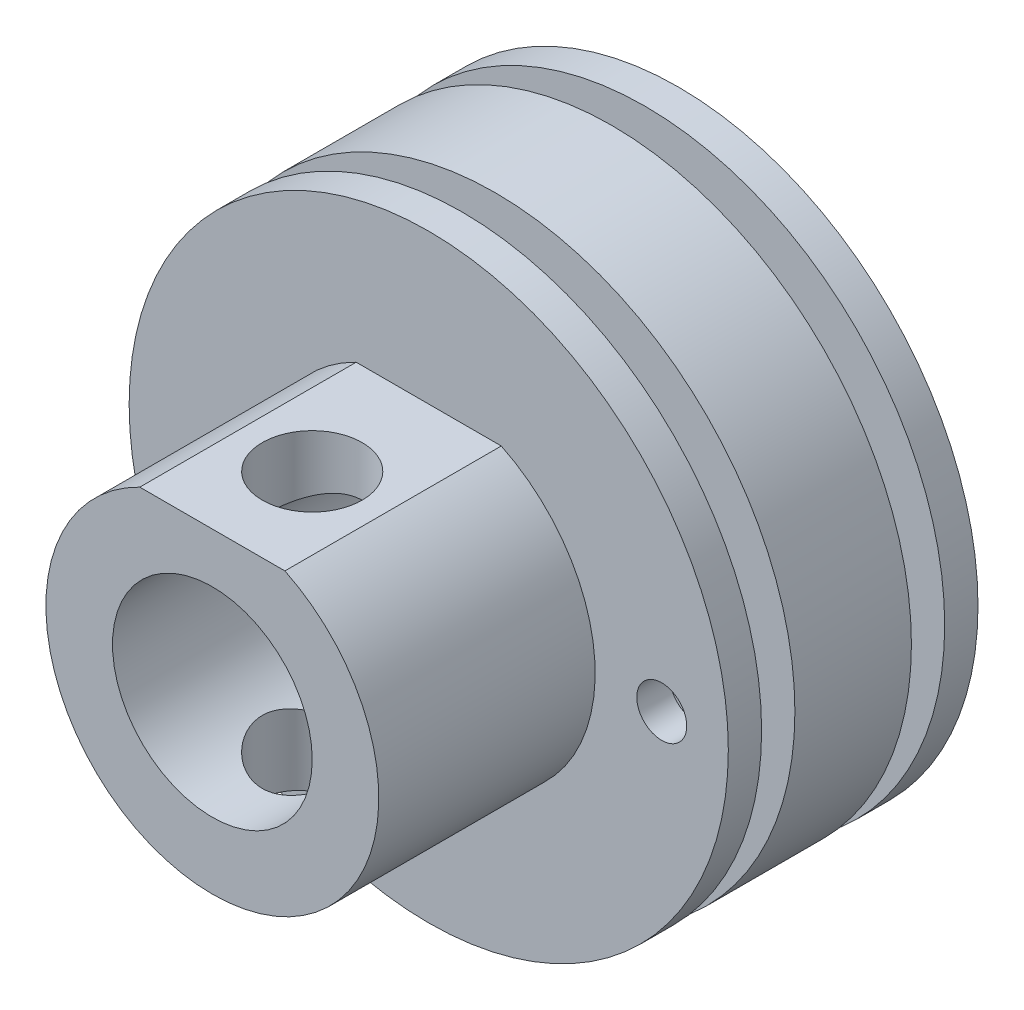
ISO-10303-21;
HEADER;
FILE_DESCRIPTION(('STEP AP214'),'2;1');
FILE_NAME('part.step','',(''),(''),'','','');
FILE_SCHEMA(('AUTOMOTIVE_DESIGN { 1 0 10303 214 1 1 1 1 }'));
ENDSEC;
DATA;
#1=APPLICATION_CONTEXT('core data for automotive mechanical design processes');
#2=APPLICATION_PROTOCOL_DEFINITION('international standard','automotive_design',2000,#1);
#3=PRODUCT_CONTEXT('',#1,'mechanical');
#4=PRODUCT('Part','Part','',(#3));
#5=PRODUCT_RELATED_PRODUCT_CATEGORY('part','',(#4));
#6=PRODUCT_DEFINITION_FORMATION('','',#4);
#7=PRODUCT_DEFINITION_CONTEXT('part definition',#1,'design');
#8=PRODUCT_DEFINITION('design','',#6,#7);
#9=PRODUCT_DEFINITION_SHAPE('','',#8);
#10=(LENGTH_UNIT() NAMED_UNIT(*) SI_UNIT(.MILLI.,.METRE.));
#11=(NAMED_UNIT(*) PLANE_ANGLE_UNIT() SI_UNIT($,.RADIAN.));
#12=(NAMED_UNIT(*) SI_UNIT($,.STERADIAN.) SOLID_ANGLE_UNIT());
#13=UNCERTAINTY_MEASURE_WITH_UNIT(LENGTH_MEASURE(1.E-05),#10,'distance_accuracy_value','');
#14=(GEOMETRIC_REPRESENTATION_CONTEXT(3) GLOBAL_UNCERTAINTY_ASSIGNED_CONTEXT((#13)) GLOBAL_UNIT_ASSIGNED_CONTEXT((#10,
#11,#12)) REPRESENTATION_CONTEXT('',''));
#15=CARTESIAN_POINT('',(0.,0.,0.));
#16=DIRECTION('',(0.,0.,1.));
#17=DIRECTION('',(1.,0.,0.));
#18=AXIS2_PLACEMENT_3D('',#15,#16,#17);
#19=CARTESIAN_POINT('',(0.,0.,14.));
#20=DIRECTION('',(0.,0.,-1.));
#21=DIRECTION('',(-1.,0.,0.));
#22=AXIS2_PLACEMENT_3D('',#19,#20,#21);
#23=CYLINDRICAL_SURFACE('',#22,5.);
#24=CARTESIAN_POINT('',(0.,-5.,12.5));
#25=CARTESIAN_POINT('',(0.0822886127532999,-4.9999992925055,12.4999990025151));
#26=CARTESIAN_POINT('',(0.164587318351529,-4.99794915693954,12.493206136376));
#27=CARTESIAN_POINT('',(0.326788125304881,-4.98997105593691,12.4662786457779));
#28=CARTESIAN_POINT('',(0.40668950441142,-4.98404193389692,12.4461400419767));
#29=CARTESIAN_POINT('',(0.561732707754526,-4.96895552501836,12.3932539830897));
#30=CARTESIAN_POINT('',(0.636881364395372,-4.95980300250425,12.3605251303811));
#31=CARTESIAN_POINT('',(0.780624181053131,-4.93922109237645,12.2834639069442));
#32=CARTESIAN_POINT('',(0.849217467469669,-4.92779140192067,12.2391299926046));
#33=CARTESIAN_POINT('',(0.979871797183745,-4.90350737192774,12.1387759925273));
#34=CARTESIAN_POINT('',(1.04171807124434,-4.89062383657036,12.0824833741141));
#35=CARTESIAN_POINT('',(1.15524920923324,-4.86505834210442,11.9603907700898));
#36=CARTESIAN_POINT('',(1.20693236327441,-4.85237641724501,11.894589187875));
#37=CARTESIAN_POINT('',(1.29980037723708,-4.82834113993772,11.7535292469624));
#38=CARTESIAN_POINT('',(1.34072309022213,-4.81702406663875,11.6780915390093));
#39=CARTESIAN_POINT('',(1.4092139477476,-4.79743620394031,11.5210107457697));
#40=CARTESIAN_POINT('',(1.43678529919973,-4.78916468313311,11.439369156072));
#41=CARTESIAN_POINT('',(1.47701633682652,-4.77690870838434,11.2746097338695));
#42=CARTESIAN_POINT('',(1.49007196234677,-4.77281069324533,11.1915972561361));
#43=CARTESIAN_POINT('',(1.50213730614672,-4.76902789749767,11.0244668437832));
#44=CARTESIAN_POINT('',(1.50115042761078,-4.76934204760571,10.9403491819409));
#45=CARTESIAN_POINT('',(1.48546977199812,-4.77424744067778,10.7766160913915));
#46=CARTESIAN_POINT('',(1.47127205262685,-4.7786838859914,10.6969477496378));
#47=CARTESIAN_POINT('',(1.43037420427056,-4.79108356228624,10.5411802137265));
#48=CARTESIAN_POINT('',(1.40367284141641,-4.79904714132351,10.4650813726257));
#49=CARTESIAN_POINT('',(1.33816026653682,-4.81772733074973,10.3173996503393));
#50=CARTESIAN_POINT('',(1.29918816934643,-4.82848016115952,10.2458929160447));
#51=CARTESIAN_POINT('',(1.21035222588683,-4.85150987000065,10.1102679779898));
#52=CARTESIAN_POINT('',(1.16048574002588,-4.86378711746991,10.0461515705862));
#53=CARTESIAN_POINT('',(1.04881290765546,-4.88911011297937,9.92431380923798));
#54=CARTESIAN_POINT('',(0.986594907466972,-4.90216654310498,9.86697133597033));
#55=CARTESIAN_POINT('',(0.853263259313967,-4.92712244063259,9.76344601593575));
#56=CARTESIAN_POINT('',(0.782149051860888,-4.9390218351841,9.71726387158557));
#57=CARTESIAN_POINT('',(0.632355038342803,-4.9604316006947,9.63714007753527));
#58=CARTESIAN_POINT('',(0.55362774974795,-4.96992543668314,9.60328248375014));
#59=CARTESIAN_POINT('',(0.39124541560352,-4.98533521832222,9.54940040990037));
#60=CARTESIAN_POINT('',(0.307591751589582,-4.99125216186999,9.52937207146751));
#61=CARTESIAN_POINT('',(0.140952242668333,-4.99868364643538,9.5043478221006));
#62=CARTESIAN_POINT('',(0.0580500976011877,-5.0003485041779,9.49883841419839));
#63=CARTESIAN_POINT('',(-0.107499605823383,-4.9995292324176,9.50156915571208));
#64=CARTESIAN_POINT('',(-0.19014719669078,-4.99704565677756,9.50980746965144));
#65=CARTESIAN_POINT('',(-0.350903605309696,-4.98830696987163,9.5393846111115));
#66=CARTESIAN_POINT('',(-0.429072772614169,-4.98213829799417,9.56042338758087));
#67=CARTESIAN_POINT('',(-0.580754638954521,-4.96674347841533,9.6146432327782));
#68=CARTESIAN_POINT('',(-0.654266777025583,-4.95751696321085,9.64782576103786));
#69=CARTESIAN_POINT('',(-0.796437189461052,-4.93669654351325,9.72625316548113));
#70=CARTESIAN_POINT('',(-0.864943826199669,-4.92505280829675,9.77175934094797));
#71=CARTESIAN_POINT('',(-0.993523307980146,-4.90073468764318,9.87322475405281));
#72=CARTESIAN_POINT('',(-1.05359403235593,-4.8880600443108,9.92918661188767));
#73=CARTESIAN_POINT('',(-1.16585744551027,-4.86253171869138,10.0523873083693));
#74=CARTESIAN_POINT('',(-1.21768481231503,-4.84968825033268,10.1199618757717));
#75=CARTESIAN_POINT('',(-1.30928995072154,-4.82576515238463,10.2631279390135));
#76=CARTESIAN_POINT('',(-1.34906803829472,-4.81468547654651,10.3387192245582));
#77=CARTESIAN_POINT('',(-1.41517347127168,-4.79567189615055,10.4955324912547));
#78=CARTESIAN_POINT('',(-1.4415634693705,-4.78772337843827,10.5767261865366));
#79=CARTESIAN_POINT('',(-1.48021730815114,-4.77591594362794,10.7426879689315));
#80=CARTESIAN_POINT('',(-1.49248598978779,-4.772055625083,10.8274548207877));
#81=CARTESIAN_POINT('',(-1.50221984485059,-4.76899972496087,10.9943615183762));
#82=CARTESIAN_POINT('',(-1.5002805530849,-4.76961647442755,11.0764636510176));
#83=CARTESIAN_POINT('',(-1.48307505444813,-4.77499401288294,11.2391141033728));
#84=CARTESIAN_POINT('',(-1.46780938124716,-4.77975463592551,11.3196624851764));
#85=CARTESIAN_POINT('',(-1.42476888804136,-4.79275763670385,11.4759453991428));
#86=CARTESIAN_POINT('',(-1.39715175507068,-4.80095604545965,11.5517272873617));
#87=CARTESIAN_POINT('',(-1.33031507121129,-4.81990278909136,11.6976424388177));
#88=CARTESIAN_POINT('',(-1.29109329962876,-4.83065161194312,11.7677746176408));
#89=CARTESIAN_POINT('',(-1.20048763805072,-4.85397676425833,11.9031631165271));
#90=CARTESIAN_POINT('',(-1.14871276092994,-4.86660540163798,11.9681487612604));
#91=CARTESIAN_POINT('',(-1.03517434629782,-4.89201320450026,12.0887024983079));
#92=CARTESIAN_POINT('',(-0.973408217134501,-4.90479240823905,12.1442681394678));
#93=CARTESIAN_POINT('',(-0.839465762183249,-4.92950936570649,12.246023412295));
#94=CARTESIAN_POINT('',(-0.767037885790609,-4.94141159765674,12.2918914468555));
#95=CARTESIAN_POINT('',(-0.615141373983531,-4.96260680455813,12.370735169904));
#96=CARTESIAN_POINT('',(-0.535676052998956,-4.97190099931067,12.4037168882745));
#97=CARTESIAN_POINT('',(-0.380757712655282,-4.98602174969301,12.4528952756527));
#98=CARTESIAN_POINT('',(-0.305786961954235,-4.99122027381068,12.4705116728832));
#99=CARTESIAN_POINT('',(-0.153880195230779,-4.99820944494492,12.4940635252416));
#100=CARTESIAN_POINT('',(-0.0769445098581395,-5.0000006615474,12.5000009327048));
#101=CARTESIAN_POINT('',(0.,-5.,12.5));
#102=B_SPLINE_CURVE_WITH_KNOTS('',3,(#24,#25,#26,#27,#28,#29,#30,#31,#32,#33,#34,#35,#36,#37,
#38,#39,#40,#41,#42,#43,#44,#45,#46,#47,#48,#49,#50,#51,#52,#53,#54,#55,#56,#57,#58,#59,#60,#61,
#62,#63,#64,#65,#66,#67,#68,#69,#70,#71,#72,#73,#74,#75,#76,#77,#78,#79,#80,#81,#82,#83,#84,#85,
#86,#87,#88,#89,#90,#91,#92,#93,#94,#95,#96,#97,#98,#99,#100,#101),.UNSPECIFIED.,.T.,.F.,(4,2,2,
2,2,2,2,2,2,2,2,2,2,2,2,2,2,2,2,2,2,2,2,2,2,2,2,2,2,2,2,2,2,2,2,2,2,2,4),(0.,0.246583203612611,
0.493239964845999,0.739533676300874,0.985860164412702,1.23855602948191,1.49129437288633,
1.74971481004109,2.00807314543223,2.25919689356599,2.51025978319089,2.75226016697676,
2.99428443658001,3.23962426447119,3.48502360158555,3.74067104048167,3.99633456531071,
4.25371046881689,4.51101453528808,4.75908809438545,5.00712853550327,5.24956746682327,
5.49203554593728,5.74011305702908,5.98825282000191,6.24540400322818,6.5025484425268,
6.75847814951251,7.01432009460283,7.25950155466943,7.504673196616,7.74680040402721,
7.98897397553107,8.2399692567993,8.49102974897502,8.7494299615667,9.00770911595235,
9.23831691930459,9.46888616948874),.UNSPECIFIED.);
#103=CARTESIAN_POINT('',(0.,-5.,12.5));
#104=VERTEX_POINT('',#103);
#105=EDGE_CURVE('E128',#104,#104,#102,.T.);
#106=ORIENTED_EDGE('',*,*,#105,.T.);
#107=EDGE_LOOP('',(#106));
#108=FACE_BOUND('',#107,.T.);
#109=DIRECTION('',(0.,0.,-1.));
#110=VECTOR('',#109,1.);
#111=CARTESIAN_POINT('',(2.17944947177034,4.5,14.));
#112=LINE('',#111,#110);
#113=CARTESIAN_POINT('',(2.17944947177034,4.5,14.));
#114=VERTEX_POINT('',#113);
#115=CARTESIAN_POINT('',(2.17944947177034,4.5,7.5));
#116=VERTEX_POINT('',#115);
#117=EDGE_CURVE('E81',#114,#116,#112,.T.);
#118=ORIENTED_EDGE('',*,*,#117,.F.);
#119=CARTESIAN_POINT('',(0.,0.,14.));
#120=DIRECTION('',(0.,0.,1.));
#121=DIRECTION('',(1.,0.,0.));
#122=AXIS2_PLACEMENT_3D('',#119,#120,#121);
#123=CIRCLE('',#122,5.);
#124=CARTESIAN_POINT('',(-2.17944947177034,4.5,14.));
#125=VERTEX_POINT('',#124);
#126=EDGE_CURVE('E88',#125,#114,#123,.T.);
#127=ORIENTED_EDGE('',*,*,#126,.F.);
#128=DIRECTION('',(0.,0.,-1.));
#129=VECTOR('',#128,1.);
#130=CARTESIAN_POINT('',(-2.17944947177034,4.5,14.));
#131=LINE('',#130,#129);
#132=CARTESIAN_POINT('',(-2.17944947177034,4.5,7.5));
#133=VERTEX_POINT('',#132);
#134=EDGE_CURVE('E69',#133,#125,#131,.F.);
#135=ORIENTED_EDGE('',*,*,#134,.F.);
#136=CARTESIAN_POINT('',(0.,0.,7.5));
#137=DIRECTION('',(0.,0.,1.));
#138=DIRECTION('',(1.,0.,0.));
#139=AXIS2_PLACEMENT_3D('',#136,#137,#138);
#140=CIRCLE('',#139,5.);
#141=EDGE_CURVE('E90',#133,#116,#140,.T.);
#142=ORIENTED_EDGE('',*,*,#141,.T.);
#143=EDGE_LOOP('',(#118,#127,#135,#142));
#144=FACE_BOUND('',#143,.T.);
#145=ADVANCED_FACE('F52',(#108,#144),#23,.T.);
#146=CARTESIAN_POINT('',(0.,0.,14.));
#147=DIRECTION('',(0.,0.,1.));
#148=DIRECTION('',(1.,0.,0.));
#149=AXIS2_PLACEMENT_3D('',#146,#147,#148);
#150=PLANE('',#149);
#151=CARTESIAN_POINT('',(0.,0.,14.));
#152=DIRECTION('',(0.,0.,1.));
#153=DIRECTION('',(1.,0.,0.));
#154=AXIS2_PLACEMENT_3D('',#151,#152,#153);
#155=CIRCLE('',#154,3.);
#156=CARTESIAN_POINT('',(3.,0.,14.));
#157=VERTEX_POINT('',#156);
#158=EDGE_CURVE('E100',#157,#157,#155,.T.);
#159=ORIENTED_EDGE('',*,*,#158,.F.);
#160=EDGE_LOOP('',(#159));
#161=FACE_BOUND('',#160,.T.);
#162=ORIENTED_EDGE('',*,*,#126,.T.);
#163=DIRECTION('',(-1.,0.,0.));
#164=VECTOR('',#163,1.);
#165=CARTESIAN_POINT('',(9.,4.5,14.));
#166=LINE('',#165,#164);
#167=EDGE_CURVE('E78',#114,#125,#166,.T.);
#168=ORIENTED_EDGE('',*,*,#167,.T.);
#169=EDGE_LOOP('',(#162,#168));
#170=FACE_BOUND('',#169,.T.);
#171=ADVANCED_FACE('F93',(#161,#170),#150,.T.);
#172=CARTESIAN_POINT('',(0.,-9.,11.));
#173=DIRECTION('',(0.,1.,0.));
#174=DIRECTION('',(0.,0.,1.));
#175=AXIS2_PLACEMENT_3D('',#172,#173,#174);
#176=CYLINDRICAL_SURFACE('',#175,1.5);
#177=CARTESIAN_POINT('',(0.,3.,12.5));
#178=CARTESIAN_POINT('',(0.0788579444268502,2.99999570107562,12.4999950465242));
#179=CARTESIAN_POINT('',(0.157809899546344,2.99685736529635,12.4937448903184));
#180=CARTESIAN_POINT('',(0.313380352903344,2.98461234055735,12.4690206794877));
#181=CARTESIAN_POINT('',(0.389994130070444,2.97549431743379,12.4505234105033));
#182=CARTESIAN_POINT('',(0.538400317320673,2.95224419105063,12.4022092870751));
#183=CARTESIAN_POINT('',(0.61021020440872,2.93813158766306,12.372436423628));
#184=CARTESIAN_POINT('',(0.747708925209898,2.90618664773642,12.3026440679525));
#185=CARTESIAN_POINT('',(0.813398240985089,2.88835460450288,12.2626253836267));
#186=CARTESIAN_POINT('',(0.941261726642864,2.84934387387093,12.1707241257721));
#187=CARTESIAN_POINT('',(1.00298281668316,2.82802798691306,12.1182702811405));
#188=CARTESIAN_POINT('',(1.11716916730047,2.78489955370115,12.0042177811294));
#189=CARTESIAN_POINT('',(1.16962737466015,2.76308664313552,11.9426122223413));
#190=CARTESIAN_POINT('',(1.26787800067542,2.71948426796021,11.8062749757149));
#191=CARTESIAN_POINT('',(1.31283800332746,2.69782780455198,11.7308958524811));
#192=CARTESIAN_POINT('',(1.38925234033604,2.65928968158481,11.5724489960207));
#193=CARTESIAN_POINT('',(1.4207163224495,2.64240461410484,11.4893868069159));
#194=CARTESIAN_POINT('',(1.46719866328288,2.61686800556713,11.3230023418671));
#195=CARTESIAN_POINT('',(1.48308878562066,2.6077840737557,11.2399933218989));
#196=CARTESIAN_POINT('',(1.50064048996327,2.59772834922792,11.0720317433308));
#197=CARTESIAN_POINT('',(1.50231613255961,2.59674854014932,10.9870811886933));
#198=CARTESIAN_POINT('',(1.49203093075844,2.60266395385873,10.8285709635269));
#199=CARTESIAN_POINT('',(1.48167683930523,2.6086314549302,10.7548639531654));
#200=CARTESIAN_POINT('',(1.4504097735854,2.62614343100775,10.6104171359404));
#201=CARTESIAN_POINT('',(1.42949343584648,2.63768968247664,10.539678282042));
#202=CARTESIAN_POINT('',(1.37731467057901,2.66531214619112,10.4011563011515));
#203=CARTESIAN_POINT('',(1.34582260067399,2.68148760995998,10.3334804018213));
#204=CARTESIAN_POINT('',(1.273562531502,2.71655106422106,10.204048561115));
#205=CARTESIAN_POINT('',(1.2327903657187,2.73544027170286,10.1422952965999));
#206=CARTESIAN_POINT('',(1.13709908236918,2.77669736854929,10.0182181208852));
#207=CARTESIAN_POINT('',(1.08104168755392,2.79920265355119,9.95681468963576));
#208=CARTESIAN_POINT('',(0.959333368112061,2.84321434950611,9.84389687211365));
#209=CARTESIAN_POINT('',(0.893677884861429,2.86472027938201,9.79238721194917));
#210=CARTESIAN_POINT('',(0.750774758747774,2.90552980924446,9.69847150845541));
#211=CARTESIAN_POINT('',(0.673130387399115,2.92468476243011,9.65659929133139));
#212=CARTESIAN_POINT('',(0.510699323233197,2.95736821681863,9.58685445643549));
#213=CARTESIAN_POINT('',(0.425918364397915,2.9709011841533,9.55897072247725));
#214=CARTESIAN_POINT('',(0.259149737491054,2.98986500612153,9.52028689442498));
#215=CARTESIAN_POINT('',(0.17751229582249,2.99587407451965,9.50826314637983));
#216=CARTESIAN_POINT('',(0.0131693999240284,3.00109520188655,9.49780290329827));
#217=CARTESIAN_POINT('',(-0.0695355298048623,3.00031048081978,9.4993599715408));
#218=CARTESIAN_POINT('',(-0.226849457978979,2.99236788380152,9.51531003262811));
#219=CARTESIAN_POINT('',(-0.301589112074894,2.98570868532253,9.52869879909499));
#220=CARTESIAN_POINT('',(-0.447610338452911,2.9673325697226,9.56635710784268));
#221=CARTESIAN_POINT('',(-0.51889152853663,2.95561509501618,9.59062784968024));
#222=CARTESIAN_POINT('',(-0.658332912674358,2.92776377120382,9.64999769964955));
#223=CARTESIAN_POINT('',(-0.726345595508704,2.91151322654446,9.68538657517443));
#224=CARTESIAN_POINT('',(-0.855692042548907,2.87615961476126,9.76566130346985));
#225=CARTESIAN_POINT('',(-0.917022944664886,2.85705533350407,9.81055120189309));
#226=CARTESIAN_POINT('',(-1.03765153393382,2.81562332004297,9.91364063799607));
#227=CARTESIAN_POINT('',(-1.09615811672854,2.79316327265249,9.97271430266772));
#228=CARTESIAN_POINT('',(-1.20278448167828,2.7489358741323,10.0998877269166));
#229=CARTESIAN_POINT('',(-1.25089707856781,2.72716901100071,10.1679936782719));
#230=CARTESIAN_POINT('',(-1.33756187171853,2.68576788309734,10.3154654812595));
#231=CARTESIAN_POINT('',(-1.37553824370037,2.66628794383591,10.3952168991417));
#232=CARTESIAN_POINT('',(-1.43712423890206,2.63361108441202,10.5612651013624));
#233=CARTESIAN_POINT('',(-1.46075237380052,2.62040607332625,10.6475532897003));
#234=CARTESIAN_POINT('',(-1.49079253120031,2.60342251538703,10.8153653343271));
#235=CARTESIAN_POINT('',(-1.49863949460818,2.59886075197597,10.8965513801529));
#236=CARTESIAN_POINT('',(-1.5010337315643,2.59748031962405,11.0591706007468));
#237=CARTESIAN_POINT('',(-1.49558676993486,2.60065829439585,11.1406036531068));
#238=CARTESIAN_POINT('',(-1.47288918838996,2.61356793076615,11.2932252523002));
#239=CARTESIAN_POINT('',(-1.45681247151455,2.62264641723988,11.3646507052171));
#240=CARTESIAN_POINT('',(-1.41476303733662,2.64556524281479,11.5037121791365));
#241=CARTESIAN_POINT('',(-1.38878713673988,2.65940711354503,11.571346973138));
#242=CARTESIAN_POINT('',(-1.32572361795085,2.69142795546803,11.7059372764798));
#243=CARTESIAN_POINT('',(-1.28800670672355,2.70983583593881,11.7725418527435));
#244=CARTESIAN_POINT('',(-1.20322645745609,2.74852997452291,11.8989118042719));
#245=CARTESIAN_POINT('',(-1.15615825686234,2.76881720693416,11.9586735957817));
#246=CARTESIAN_POINT('',(-1.04730498999206,2.81193484737138,12.077212973532));
#247=CARTESIAN_POINT('',(-0.984426634495894,2.83477474959942,12.1349886535254));
#248=CARTESIAN_POINT('',(-0.849232209349798,2.87816628389896,12.2393944751529));
#249=CARTESIAN_POINT('',(-0.776911084957797,2.89871667939293,12.2860186092049));
#250=CARTESIAN_POINT('',(-0.623897395174419,2.93547014349806,12.3668545440681));
#251=CARTESIAN_POINT('',(-0.543149255665096,2.95164144740899,12.4009762538547));
#252=CARTESIAN_POINT('',(-0.37611315170713,2.9775201194848,12.4547122516361));
#253=CARTESIAN_POINT('',(-0.28984169938365,2.98724585044602,12.4743677702086));
#254=CARTESIAN_POINT('',(-0.168902919736343,2.99543192870217,12.4908461166286));
#255=CARTESIAN_POINT('',(-0.135242819162348,2.99714048010376,12.4942739612995));
#256=CARTESIAN_POINT('',(-0.0677275977076381,2.99942545465223,12.4988519982711));
#257=CARTESIAN_POINT('',(-0.0338724714699431,3.00000184655072,12.5000021277053));
#258=CARTESIAN_POINT('',(0.,3.,12.5));
#259=B_SPLINE_CURVE_WITH_KNOTS('',3,(#177,#178,#179,#180,#181,#182,#183,#184,#185,#186,#187,
#188,#189,#190,#191,#192,#193,#194,#195,#196,#197,#198,#199,#200,#201,#202,#203,#204,#205,#206,
#207,#208,#209,#210,#211,#212,#213,#214,#215,#216,#217,#218,#219,#220,#221,#222,#223,#224,#225,
#226,#227,#228,#229,#230,#231,#232,#233,#234,#235,#236,#237,#238,#239,#240,#241,#242,#243,#244,
#245,#246,#247,#248,#249,#250,#251,#252,#253,#254,#255,#256,#257,#258),.UNSPECIFIED.,.T.,.F.,(4,
2,2,2,2,2,2,2,2,2,2,2,2,2,2,2,2,2,2,2,2,2,2,2,2,2,2,2,2,2,2,2,2,2,2,2,2,2,2,2,4),(0.,
0.236436386130439,0.473322224563796,0.709293233238448,0.945245640872352,1.19547263807713,
1.44588935648105,1.71572589646129,1.98536921847421,2.23887018210344,2.4921203599353,
2.7150856861398,2.93812205888517,3.16635360252731,3.39468781890332,3.65197412000818,
3.90938301898029,4.17874533321661,4.44789325368419,4.69474935707018,4.94148846767214,
5.16910359759183,5.39674382446397,5.63089284041848,5.86514176122509,6.12239415966628,
6.37982382923147,6.64972023242589,6.91926767918176,7.1629396125457,7.40650589797017,
7.62686895373283,7.84730293182526,8.0825468517043,8.31791341715446,8.58187864135757,
8.84598575071869,9.1119602049529,9.37717362931724,9.47872920200875,9.58028757766599),.UNSPECIFIED.);
#260=CARTESIAN_POINT('',(0.,3.,12.5));
#261=VERTEX_POINT('',#260);
#262=EDGE_CURVE('E103',#261,#261,#259,.T.);
#263=ORIENTED_EDGE('',*,*,#262,.F.);
#264=EDGE_LOOP('',(#263));
#265=FACE_BOUND('',#264,.T.);
#266=CARTESIAN_POINT('',(0.,4.5,11.));
#267=DIRECTION('',(0.,1.,0.));
#268=DIRECTION('',(0.,0.,1.));
#269=AXIS2_PLACEMENT_3D('',#266,#267,#268);
#270=CIRCLE('',#269,1.5);
#271=CARTESIAN_POINT('',(0.,4.5,12.5));
#272=VERTEX_POINT('',#271);
#273=EDGE_CURVE('E56',#272,#272,#270,.F.);
#274=ORIENTED_EDGE('',*,*,#273,.F.);
#275=EDGE_LOOP('',(#274));
#276=FACE_BOUND('',#275,.T.);
#277=ADVANCED_FACE('F123',(#265,#276),#176,.F.);
#278=CARTESIAN_POINT('',(0.,0.,7.5));
#279=DIRECTION('',(0.,0.,-1.));
#280=DIRECTION('',(-1.,0.,0.));
#281=AXIS2_PLACEMENT_3D('',#278,#279,#280);
#282=CYLINDRICAL_SURFACE('',#281,9.);
#283=CARTESIAN_POINT('',(0.,0.,7.5));
#284=DIRECTION('',(0.,0.,1.));
#285=DIRECTION('',(1.,0.,0.));
#286=AXIS2_PLACEMENT_3D('',#283,#284,#285);
#287=CIRCLE('',#286,9.);
#288=CARTESIAN_POINT('',(9.,0.,7.5));
#289=VERTEX_POINT('',#288);
#290=EDGE_CURVE('E13',#289,#289,#287,.T.);
#291=ORIENTED_EDGE('',*,*,#290,.F.);
#292=EDGE_LOOP('',(#291));
#293=FACE_BOUND('',#292,.T.);
#294=CARTESIAN_POINT('',(0.,0.,6.5));
#295=DIRECTION('',(0.,0.,-1.));
#296=DIRECTION('',(-1.,0.,0.));
#297=AXIS2_PLACEMENT_3D('',#294,#295,#296);
#298=CIRCLE('',#297,9.);
#299=CARTESIAN_POINT('',(-9.,0.,6.5));
#300=VERTEX_POINT('',#299);
#301=EDGE_CURVE('E167',#300,#300,#298,.T.);
#302=ORIENTED_EDGE('',*,*,#301,.F.);
#303=EDGE_LOOP('',(#302));
#304=FACE_BOUND('',#303,.T.);
#305=ADVANCED_FACE('F54',(#293,#304),#282,.T.);
#306=CARTESIAN_POINT('',(0.,0.,2.));
#307=DIRECTION('',(0.,0.,-1.));
#308=DIRECTION('',(-1.,0.,0.));
#309=AXIS2_PLACEMENT_3D('',#306,#307,#308);
#310=CIRCLE('',#309,9.);
#311=CARTESIAN_POINT('',(-9.,0.,2.));
#312=VERTEX_POINT('',#311);
#313=EDGE_CURVE('E111',#312,#312,#310,.T.);
#314=ORIENTED_EDGE('',*,*,#313,.F.);
#315=EDGE_LOOP('',(#314));
#316=FACE_BOUND('',#315,.T.);
#317=CARTESIAN_POINT('',(0.,0.,5.5));
#318=DIRECTION('',(0.,0.,-1.));
#319=DIRECTION('',(-1.,0.,0.));
#320=AXIS2_PLACEMENT_3D('',#317,#318,#319);
#321=CIRCLE('',#320,9.);
#322=CARTESIAN_POINT('',(-9.,0.,5.5));
#323=VERTEX_POINT('',#322);
#324=EDGE_CURVE('E188',#323,#323,#321,.T.);
#325=ORIENTED_EDGE('',*,*,#324,.T.);
#326=EDGE_LOOP('',(#325));
#327=FACE_BOUND('',#326,.T.);
#328=ADVANCED_FACE('F161',(#316,#327),#282,.T.);
#329=CARTESIAN_POINT('',(0.,0.,0.));
#330=DIRECTION('',(0.,0.,1.));
#331=DIRECTION('',(1.,0.,0.));
#332=AXIS2_PLACEMENT_3D('',#329,#330,#331);
#333=CIRCLE('',#332,9.);
#334=CARTESIAN_POINT('',(9.,0.,0.));
#335=VERTEX_POINT('',#334);
#336=EDGE_CURVE('E61',#335,#335,#333,.T.);
#337=ORIENTED_EDGE('',*,*,#336,.T.);
#338=EDGE_LOOP('',(#337));
#339=FACE_BOUND('',#338,.T.);
#340=CARTESIAN_POINT('',(0.,0.,1.));
#341=DIRECTION('',(0.,0.,-1.));
#342=DIRECTION('',(-1.,0.,0.));
#343=AXIS2_PLACEMENT_3D('',#340,#341,#342);
#344=CIRCLE('',#343,9.);
#345=CARTESIAN_POINT('',(-9.,0.,1.));
#346=VERTEX_POINT('',#345);
#347=EDGE_CURVE('E164',#346,#346,#344,.T.);
#348=ORIENTED_EDGE('',*,*,#347,.T.);
#349=EDGE_LOOP('',(#348));
#350=FACE_BOUND('',#349,.T.);
#351=ADVANCED_FACE('F142',(#339,#350),#282,.T.);
#352=CARTESIAN_POINT('',(0.,0.,7.5));
#353=DIRECTION('',(0.,0.,1.));
#354=DIRECTION('',(1.,0.,0.));
#355=AXIS2_PLACEMENT_3D('',#352,#353,#354);
#356=PLANE('',#355);
#357=DIRECTION('',(-1.,0.,0.));
#358=VECTOR('',#357,1.);
#359=CARTESIAN_POINT('',(9.,4.5,7.5));
#360=LINE('',#359,#358);
#361=EDGE_CURVE('E74',#116,#133,#360,.T.);
#362=ORIENTED_EDGE('',*,*,#361,.F.);
#363=ORIENTED_EDGE('',*,*,#141,.F.);
#364=EDGE_LOOP('',(#362,#363));
#365=FACE_BOUND('',#364,.T.);
#366=ORIENTED_EDGE('',*,*,#290,.T.);
#367=EDGE_LOOP('',(#366));
#368=FACE_BOUND('',#367,.T.);
#369=CARTESIAN_POINT('',(7.,0.,7.5));
#370=DIRECTION('',(0.,0.,1.));
#371=DIRECTION('',(1.,0.,0.));
#372=AXIS2_PLACEMENT_3D('',#369,#370,#371);
#373=CIRCLE('',#372,0.749999999999999);
#374=CARTESIAN_POINT('',(7.75,0.,7.5));
#375=VERTEX_POINT('',#374);
#376=EDGE_CURVE('E91',#375,#375,#373,.T.);
#377=ORIENTED_EDGE('',*,*,#376,.F.);
#378=EDGE_LOOP('',(#377));
#379=FACE_BOUND('',#378,.T.);
#380=ADVANCED_FACE('F139',(#365,#368,#379),#356,.T.);
#381=CARTESIAN_POINT('',(0.,0.,0.));
#382=DIRECTION('',(0.,0.,1.));
#383=DIRECTION('',(1.,0.,0.));
#384=AXIS2_PLACEMENT_3D('',#381,#382,#383);
#385=PLANE('',#384);
#386=CARTESIAN_POINT('',(7.,0.,0.));
#387=DIRECTION('',(0.,0.,1.));
#388=DIRECTION('',(1.,0.,0.));
#389=AXIS2_PLACEMENT_3D('',#386,#387,#388);
#390=CIRCLE('',#389,0.749999999999999);
#391=CARTESIAN_POINT('',(7.75,0.,0.));
#392=VERTEX_POINT('',#391);
#393=EDGE_CURVE('E153',#392,#392,#390,.T.);
#394=ORIENTED_EDGE('',*,*,#393,.T.);
#395=EDGE_LOOP('',(#394));
#396=FACE_BOUND('',#395,.T.);
#397=CARTESIAN_POINT('',(0.,0.,0.));
#398=DIRECTION('',(0.,0.,1.));
#399=DIRECTION('',(1.,0.,0.));
#400=AXIS2_PLACEMENT_3D('',#397,#398,#399);
#401=CIRCLE('',#400,3.);
#402=CARTESIAN_POINT('',(3.,0.,0.));
#403=VERTEX_POINT('',#402);
#404=EDGE_CURVE('E97',#403,#403,#401,.T.);
#405=ORIENTED_EDGE('',*,*,#404,.T.);
#406=EDGE_LOOP('',(#405));
#407=FACE_BOUND('',#406,.T.);
#408=ORIENTED_EDGE('',*,*,#336,.F.);
#409=EDGE_LOOP('',(#408));
#410=FACE_BOUND('',#409,.T.);
#411=ADVANCED_FACE('F141',(#396,#407,#410),#385,.F.);
#412=CARTESIAN_POINT('',(0.,0.,0.));
#413=DIRECTION('',(0.,0.,1.));
#414=DIRECTION('',(1.,0.,0.));
#415=AXIS2_PLACEMENT_3D('',#412,#413,#414);
#416=CYLINDRICAL_SURFACE('',#415,3.);
#417=CARTESIAN_POINT('',(0.,-3.,12.5));
#418=CARTESIAN_POINT('',(-0.0788579444268502,-2.99999570107562,12.4999950465242));
#419=CARTESIAN_POINT('',(-0.157809899546344,-2.99685736529635,12.4937448903184));
#420=CARTESIAN_POINT('',(-0.313380352903344,-2.98461234055736,12.4690206794877));
#421=CARTESIAN_POINT('',(-0.389994130070444,-2.97549431743379,12.4505234105033));
#422=CARTESIAN_POINT('',(-0.538400317320673,-2.95224419105063,12.4022092870751));
#423=CARTESIAN_POINT('',(-0.610210204408719,-2.93813158766306,12.372436423628));
#424=CARTESIAN_POINT('',(-0.747708925209898,-2.90618664773642,12.3026440679525));
#425=CARTESIAN_POINT('',(-0.813398240985089,-2.88835460450288,12.2626253836267));
#426=CARTESIAN_POINT('',(-0.941261726642864,-2.84934387387093,12.1707241257721));
#427=CARTESIAN_POINT('',(-1.00298281668316,-2.82802798691306,12.1182702811405));
#428=CARTESIAN_POINT('',(-1.11716916730047,-2.78489955370115,12.0042177811294));
#429=CARTESIAN_POINT('',(-1.16962737466015,-2.76308664313552,11.9426122223413));
#430=CARTESIAN_POINT('',(-1.26787800067542,-2.71948426796021,11.8062749757149));
#431=CARTESIAN_POINT('',(-1.31283800332746,-2.69782780455198,11.7308958524811));
#432=CARTESIAN_POINT('',(-1.38925234033604,-2.65928968158481,11.5724489960207));
#433=CARTESIAN_POINT('',(-1.4207163224495,-2.64240461410484,11.4893868069159));
#434=CARTESIAN_POINT('',(-1.46719866328288,-2.61686800556713,11.3230023418671));
#435=CARTESIAN_POINT('',(-1.48308878562066,-2.6077840737557,11.2399933218989));
#436=CARTESIAN_POINT('',(-1.50064048996327,-2.59772834922792,11.0720317433308));
#437=CARTESIAN_POINT('',(-1.50231613255961,-2.59674854014932,10.9870811886933));
#438=CARTESIAN_POINT('',(-1.49203093075844,-2.60266395385873,10.8285709635269));
#439=CARTESIAN_POINT('',(-1.48167683930523,-2.6086314549302,10.7548639531654));
#440=CARTESIAN_POINT('',(-1.4504097735854,-2.62614343100775,10.6104171359404));
#441=CARTESIAN_POINT('',(-1.42949343584648,-2.63768968247664,10.539678282042));
#442=CARTESIAN_POINT('',(-1.37731467057901,-2.66531214619112,10.4011563011515));
#443=CARTESIAN_POINT('',(-1.34582260067399,-2.68148760995998,10.3334804018213));
#444=CARTESIAN_POINT('',(-1.273562531502,-2.71655106422106,10.204048561115));
#445=CARTESIAN_POINT('',(-1.2327903657187,-2.73544027170286,10.1422952965999));
#446=CARTESIAN_POINT('',(-1.13709908236918,-2.77669736854929,10.0182181208852));
#447=CARTESIAN_POINT('',(-1.08104168755392,-2.79920265355119,9.95681468963576));
#448=CARTESIAN_POINT('',(-0.959333368112061,-2.84321434950611,9.84389687211365));
#449=CARTESIAN_POINT('',(-0.893677884861429,-2.86472027938201,9.79238721194917));
#450=CARTESIAN_POINT('',(-0.750774758747773,-2.90552980924446,9.69847150845541));
#451=CARTESIAN_POINT('',(-0.673130387399114,-2.92468476243011,9.65659929133139));
#452=CARTESIAN_POINT('',(-0.510699323233196,-2.95736821681863,9.58685445643549));
#453=CARTESIAN_POINT('',(-0.425918364397915,-2.9709011841533,9.55897072247725));
#454=CARTESIAN_POINT('',(-0.259149737491054,-2.98986500612153,9.52028689442498));
#455=CARTESIAN_POINT('',(-0.17751229582249,-2.99587407451965,9.50826314637983));
#456=CARTESIAN_POINT('',(-0.0131693999240281,-3.00109520188655,9.49780290329827));
#457=CARTESIAN_POINT('',(0.0695355298048626,-3.00031048081978,9.4993599715408));
#458=CARTESIAN_POINT('',(0.22684945797898,-2.99236788380152,9.51531003262811));
#459=CARTESIAN_POINT('',(0.301589112074895,-2.98570868532253,9.52869879909499));
#460=CARTESIAN_POINT('',(0.447610338452911,-2.9673325697226,9.56635710784268));
#461=CARTESIAN_POINT('',(0.51889152853663,-2.95561509501618,9.59062784968024));
#462=CARTESIAN_POINT('',(0.658332912674359,-2.92776377120382,9.64999769964955));
#463=CARTESIAN_POINT('',(0.726345595508705,-2.91151322654446,9.68538657517443));
#464=CARTESIAN_POINT('',(0.855692042548907,-2.87615961476126,9.76566130346985));
#465=CARTESIAN_POINT('',(0.917022944664887,-2.85705533350407,9.81055120189309));
#466=CARTESIAN_POINT('',(1.03765153393382,-2.81562332004297,9.91364063799607));
#467=CARTESIAN_POINT('',(1.09615811672854,-2.79316327265249,9.97271430266772));
#468=CARTESIAN_POINT('',(1.20278448167828,-2.7489358741323,10.0998877269166));
#469=CARTESIAN_POINT('',(1.25089707856781,-2.72716901100071,10.1679936782719));
#470=CARTESIAN_POINT('',(1.33756187171853,-2.68576788309734,10.3154654812595));
#471=CARTESIAN_POINT('',(1.37553824370037,-2.66628794383591,10.3952168991417));
#472=CARTESIAN_POINT('',(1.43712423890206,-2.63361108441202,10.5612651013624));
#473=CARTESIAN_POINT('',(1.46075237380052,-2.62040607332625,10.6475532897003));
#474=CARTESIAN_POINT('',(1.49079253120031,-2.60342251538703,10.8153653343271));
#475=CARTESIAN_POINT('',(1.49863949460818,-2.59886075197597,10.8965513801529));
#476=CARTESIAN_POINT('',(1.5010337315643,-2.59748031962405,11.0591706007468));
#477=CARTESIAN_POINT('',(1.49558676993486,-2.60065829439585,11.1406036531068));
#478=CARTESIAN_POINT('',(1.47288918838996,-2.61356793076615,11.2932252523002));
#479=CARTESIAN_POINT('',(1.45681247151455,-2.62264641723988,11.3646507052171));
#480=CARTESIAN_POINT('',(1.41476303733662,-2.64556524281479,11.5037121791365));
#481=CARTESIAN_POINT('',(1.38878713673988,-2.65940711354503,11.571346973138));
#482=CARTESIAN_POINT('',(1.32572361795085,-2.69142795546804,11.7059372764798));
#483=CARTESIAN_POINT('',(1.28800670672355,-2.70983583593881,11.7725418527435));
#484=CARTESIAN_POINT('',(1.20322645745609,-2.74852997452291,11.8989118042719));
#485=CARTESIAN_POINT('',(1.15615825686234,-2.76881720693416,11.9586735957817));
#486=CARTESIAN_POINT('',(1.04730498999206,-2.81193484737138,12.077212973532));
#487=CARTESIAN_POINT('',(0.984426634495892,-2.83477474959942,12.1349886535254));
#488=CARTESIAN_POINT('',(0.849232209349796,-2.87816628389896,12.2393944751529));
#489=CARTESIAN_POINT('',(0.776911084957797,-2.89871667939293,12.2860186092049));
#490=CARTESIAN_POINT('',(0.623897395174419,-2.93547014349806,12.3668545440681));
#491=CARTESIAN_POINT('',(0.543149255665097,-2.95164144740899,12.4009762538547));
#492=CARTESIAN_POINT('',(0.376113151707131,-2.9775201194848,12.4547122516361));
#493=CARTESIAN_POINT('',(0.289841699383651,-2.98724585044602,12.4743677702086));
#494=CARTESIAN_POINT('',(0.168902919736343,-2.99543192870217,12.4908461166286));
#495=CARTESIAN_POINT('',(0.135242819162347,-2.99714048010376,12.4942739612995));
#496=CARTESIAN_POINT('',(0.0677275977076368,-2.99942545465223,12.4988519982711));
#497=CARTESIAN_POINT('',(0.0338724714699424,-3.00000184655071,12.5000021277053));
#498=CARTESIAN_POINT('',(0.,-3.,12.5));
#499=B_SPLINE_CURVE_WITH_KNOTS('',3,(#417,#418,#419,#420,#421,#422,#423,#424,#425,#426,#427,
#428,#429,#430,#431,#432,#433,#434,#435,#436,#437,#438,#439,#440,#441,#442,#443,#444,#445,#446,
#447,#448,#449,#450,#451,#452,#453,#454,#455,#456,#457,#458,#459,#460,#461,#462,#463,#464,#465,
#466,#467,#468,#469,#470,#471,#472,#473,#474,#475,#476,#477,#478,#479,#480,#481,#482,#483,#484,
#485,#486,#487,#488,#489,#490,#491,#492,#493,#494,#495,#496,#497,#498),.UNSPECIFIED.,.T.,.F.,(4,
2,2,2,2,2,2,2,2,2,2,2,2,2,2,2,2,2,2,2,2,2,2,2,2,2,2,2,2,2,2,2,2,2,2,2,2,2,2,2,4),(0.,
0.236436386130439,0.473322224563796,0.709293233238448,0.945245640872352,1.19547263807713,
1.44588935648105,1.71572589646129,1.98536921847421,2.23887018210344,2.4921203599353,
2.7150856861398,2.93812205888517,3.16635360252731,3.39468781890332,3.65197412000818,
3.90938301898029,4.17874533321661,4.44789325368419,4.69474935707018,4.94148846767214,
5.16910359759183,5.39674382446397,5.63089284041848,5.86514176122509,6.12239415966628,
6.37982382923147,6.64972023242589,6.91926767918176,7.1629396125457,7.40650589797017,
7.62686895373283,7.84730293182526,8.08254685170431,8.31791341715446,8.58187864135757,
8.84598575071868,9.1119602049529,9.37717362931724,9.47872920200875,9.58028757766599),.UNSPECIFIED.);
#500=CARTESIAN_POINT('',(0.,-3.,12.5));
#501=VERTEX_POINT('',#500);
#502=EDGE_CURVE('E110',#501,#501,#499,.T.);
#503=ORIENTED_EDGE('',*,*,#502,.T.);
#504=EDGE_LOOP('',(#503));
#505=FACE_BOUND('',#504,.T.);
#506=ORIENTED_EDGE('',*,*,#262,.T.);
#507=EDGE_LOOP('',(#506));
#508=FACE_BOUND('',#507,.T.);
#509=ORIENTED_EDGE('',*,*,#404,.F.);
#510=EDGE_LOOP('',(#509));
#511=FACE_BOUND('',#510,.T.);
#512=ORIENTED_EDGE('',*,*,#158,.T.);
#513=EDGE_LOOP('',(#512));
#514=FACE_BOUND('',#513,.T.);
#515=ADVANCED_FACE('F114',(#505,#508,#511,#514),#416,.F.);
#516=ORIENTED_EDGE('',*,*,#502,.F.);
#517=EDGE_LOOP('',(#516));
#518=FACE_BOUND('',#517,.T.);
#519=ORIENTED_EDGE('',*,*,#105,.F.);
#520=EDGE_LOOP('',(#519));
#521=FACE_BOUND('',#520,.T.);
#522=ADVANCED_FACE('F117',(#518,#521),#176,.F.);
#523=CARTESIAN_POINT('',(9.,0.,2.));
#524=DIRECTION('',(0.,0.,-1.));
#525=DIRECTION('',(-1.,0.,0.));
#526=AXIS2_PLACEMENT_3D('',#523,#524,#525);
#527=PLANE('',#526);
#528=CARTESIAN_POINT('',(7.,0.,2.));
#529=DIRECTION('',(0.,0.,-1.));
#530=DIRECTION('',(-1.,0.,0.));
#531=AXIS2_PLACEMENT_3D('',#528,#529,#530);
#532=CIRCLE('',#531,0.749999999999999);
#533=CARTESIAN_POINT('',(6.25,0.,2.));
#534=VERTEX_POINT('',#533);
#535=EDGE_CURVE('E194',#534,#534,#532,.T.);
#536=ORIENTED_EDGE('',*,*,#535,.F.);
#537=EDGE_LOOP('',(#536));
#538=FACE_BOUND('',#537,.T.);
#539=ORIENTED_EDGE('',*,*,#313,.T.);
#540=EDGE_LOOP('',(#539));
#541=FACE_BOUND('',#540,.T.);
#542=CARTESIAN_POINT('',(0.,0.,2.));
#543=DIRECTION('',(0.,0.,-1.));
#544=DIRECTION('',(-1.,0.,0.));
#545=AXIS2_PLACEMENT_3D('',#542,#543,#544);
#546=CIRCLE('',#545,5.);
#547=CARTESIAN_POINT('',(-5.,0.,2.));
#548=VERTEX_POINT('',#547);
#549=EDGE_CURVE('E170',#548,#548,#546,.T.);
#550=ORIENTED_EDGE('',*,*,#549,.F.);
#551=EDGE_LOOP('',(#550));
#552=FACE_BOUND('',#551,.T.);
#553=ADVANCED_FACE('F121',(#538,#541,#552),#527,.T.);
#554=CARTESIAN_POINT('',(0.,0.,-0.802981009103612));
#555=DIRECTION('',(0.,0.,-1.));
#556=DIRECTION('',(-1.,0.,0.));
#557=AXIS2_PLACEMENT_3D('',#554,#555,#556);
#558=CYLINDRICAL_SURFACE('',#557,5.);
#559=ORIENTED_EDGE('',*,*,#549,.T.);
#560=EDGE_LOOP('',(#559));
#561=FACE_BOUND('',#560,.T.);
#562=CARTESIAN_POINT('',(0.,0.,1.));
#563=DIRECTION('',(0.,0.,-1.));
#564=DIRECTION('',(-1.,0.,0.));
#565=AXIS2_PLACEMENT_3D('',#562,#563,#564);
#566=CIRCLE('',#565,5.);
#567=CARTESIAN_POINT('',(-5.,0.,1.));
#568=VERTEX_POINT('',#567);
#569=EDGE_CURVE('E166',#568,#568,#566,.T.);
#570=ORIENTED_EDGE('',*,*,#569,.F.);
#571=EDGE_LOOP('',(#570));
#572=FACE_BOUND('',#571,.T.);
#573=ADVANCED_FACE('F214',(#561,#572),#558,.T.);
#574=CARTESIAN_POINT('',(9.,0.,1.));
#575=DIRECTION('',(0.,0.,1.));
#576=DIRECTION('',(1.,0.,0.));
#577=AXIS2_PLACEMENT_3D('',#574,#575,#576);
#578=PLANE('',#577);
#579=CARTESIAN_POINT('',(7.,0.,1.));
#580=DIRECTION('',(0.,0.,1.));
#581=DIRECTION('',(1.,0.,0.));
#582=AXIS2_PLACEMENT_3D('',#579,#580,#581);
#583=CIRCLE('',#582,0.749999999999999);
#584=CARTESIAN_POINT('',(7.75,0.,1.));
#585=VERTEX_POINT('',#584);
#586=EDGE_CURVE('E233',#585,#585,#583,.T.);
#587=ORIENTED_EDGE('',*,*,#586,.F.);
#588=EDGE_LOOP('',(#587));
#589=FACE_BOUND('',#588,.T.);
#590=ORIENTED_EDGE('',*,*,#569,.T.);
#591=EDGE_LOOP('',(#590));
#592=FACE_BOUND('',#591,.T.);
#593=ORIENTED_EDGE('',*,*,#347,.F.);
#594=EDGE_LOOP('',(#593));
#595=FACE_BOUND('',#594,.T.);
#596=ADVANCED_FACE('F205',(#589,#592,#595),#578,.T.);
#597=CARTESIAN_POINT('',(9.,0.,6.5));
#598=DIRECTION('',(0.,0.,-1.));
#599=DIRECTION('',(-1.,0.,0.));
#600=AXIS2_PLACEMENT_3D('',#597,#598,#599);
#601=PLANE('',#600);
#602=CARTESIAN_POINT('',(7.,0.,6.5));
#603=DIRECTION('',(0.,0.,-1.));
#604=DIRECTION('',(-1.,0.,0.));
#605=AXIS2_PLACEMENT_3D('',#602,#603,#604);
#606=CIRCLE('',#605,0.749999999999999);
#607=CARTESIAN_POINT('',(6.25,0.,6.5));
#608=VERTEX_POINT('',#607);
#609=EDGE_CURVE('E235',#608,#608,#606,.T.);
#610=ORIENTED_EDGE('',*,*,#609,.F.);
#611=EDGE_LOOP('',(#610));
#612=FACE_BOUND('',#611,.T.);
#613=ORIENTED_EDGE('',*,*,#301,.T.);
#614=EDGE_LOOP('',(#613));
#615=FACE_BOUND('',#614,.T.);
#616=CARTESIAN_POINT('',(0.,0.,6.5));
#617=DIRECTION('',(0.,0.,-1.));
#618=DIRECTION('',(-1.,0.,0.));
#619=AXIS2_PLACEMENT_3D('',#616,#617,#618);
#620=CIRCLE('',#619,5.);
#621=CARTESIAN_POINT('',(-5.,0.,6.5));
#622=VERTEX_POINT('',#621);
#623=EDGE_CURVE('E173',#622,#622,#620,.T.);
#624=ORIENTED_EDGE('',*,*,#623,.F.);
#625=EDGE_LOOP('',(#624));
#626=FACE_BOUND('',#625,.T.);
#627=ADVANCED_FACE('F203',(#612,#615,#626),#601,.T.);
#628=CARTESIAN_POINT('',(0.,0.,-0.802981009103612));
#629=DIRECTION('',(0.,0.,-1.));
#630=DIRECTION('',(-1.,0.,0.));
#631=AXIS2_PLACEMENT_3D('',#628,#629,#630);
#632=CYLINDRICAL_SURFACE('',#631,5.);
#633=ORIENTED_EDGE('',*,*,#623,.T.);
#634=EDGE_LOOP('',(#633));
#635=FACE_BOUND('',#634,.T.);
#636=CARTESIAN_POINT('',(0.,0.,5.5));
#637=DIRECTION('',(0.,0.,-1.));
#638=DIRECTION('',(-1.,0.,0.));
#639=AXIS2_PLACEMENT_3D('',#636,#637,#638);
#640=CIRCLE('',#639,5.);
#641=CARTESIAN_POINT('',(-5.,0.,5.5));
#642=VERTEX_POINT('',#641);
#643=EDGE_CURVE('E190',#642,#642,#640,.T.);
#644=ORIENTED_EDGE('',*,*,#643,.F.);
#645=EDGE_LOOP('',(#644));
#646=FACE_BOUND('',#645,.T.);
#647=ADVANCED_FACE('F200',(#635,#646),#632,.T.);
#648=CARTESIAN_POINT('',(9.,0.,5.5));
#649=DIRECTION('',(0.,0.,1.));
#650=DIRECTION('',(1.,0.,0.));
#651=AXIS2_PLACEMENT_3D('',#648,#649,#650);
#652=PLANE('',#651);
#653=CARTESIAN_POINT('',(7.,0.,5.5));
#654=DIRECTION('',(0.,0.,1.));
#655=DIRECTION('',(1.,0.,0.));
#656=AXIS2_PLACEMENT_3D('',#653,#654,#655);
#657=CIRCLE('',#656,0.749999999999999);
#658=CARTESIAN_POINT('',(7.75,0.,5.5));
#659=VERTEX_POINT('',#658);
#660=EDGE_CURVE('E240',#659,#659,#657,.T.);
#661=ORIENTED_EDGE('',*,*,#660,.F.);
#662=EDGE_LOOP('',(#661));
#663=FACE_BOUND('',#662,.T.);
#664=ORIENTED_EDGE('',*,*,#643,.T.);
#665=EDGE_LOOP('',(#664));
#666=FACE_BOUND('',#665,.T.);
#667=ORIENTED_EDGE('',*,*,#324,.F.);
#668=EDGE_LOOP('',(#667));
#669=FACE_BOUND('',#668,.T.);
#670=ADVANCED_FACE('F212',(#663,#666,#669),#652,.T.);
#671=CARTESIAN_POINT('',(7.,0.,-2.5));
#672=DIRECTION('',(0.,0.,1.));
#673=DIRECTION('',(1.,0.,0.));
#674=AXIS2_PLACEMENT_3D('',#671,#672,#673);
#675=CYLINDRICAL_SURFACE('',#674,0.749999999999999);
#676=ORIENTED_EDGE('',*,*,#535,.T.);
#677=EDGE_LOOP('',(#676));
#678=FACE_BOUND('',#677,.T.);
#679=ORIENTED_EDGE('',*,*,#660,.T.);
#680=EDGE_LOOP('',(#679));
#681=FACE_BOUND('',#680,.T.);
#682=ADVANCED_FACE('F283',(#678,#681),#675,.F.);
#683=ORIENTED_EDGE('',*,*,#609,.T.);
#684=EDGE_LOOP('',(#683));
#685=FACE_BOUND('',#684,.T.);
#686=ORIENTED_EDGE('',*,*,#376,.T.);
#687=EDGE_LOOP('',(#686));
#688=FACE_BOUND('',#687,.T.);
#689=ADVANCED_FACE('F280',(#685,#688),#675,.F.);
#690=ORIENTED_EDGE('',*,*,#586,.T.);
#691=EDGE_LOOP('',(#690));
#692=FACE_BOUND('',#691,.T.);
#693=ORIENTED_EDGE('',*,*,#393,.F.);
#694=EDGE_LOOP('',(#693));
#695=FACE_BOUND('',#694,.T.);
#696=ADVANCED_FACE('F275',(#692,#695),#675,.F.);
#697=CARTESIAN_POINT('',(9.,4.5,7.5));
#698=DIRECTION('',(0.,1.,0.));
#699=DIRECTION('',(0.,0.,1.));
#700=AXIS2_PLACEMENT_3D('',#697,#698,#699);
#701=PLANE('',#700);
#702=ORIENTED_EDGE('',*,*,#273,.T.);
#703=EDGE_LOOP('',(#702));
#704=FACE_BOUND('',#703,.T.);
#705=ORIENTED_EDGE('',*,*,#117,.T.);
#706=ORIENTED_EDGE('',*,*,#361,.T.);
#707=ORIENTED_EDGE('',*,*,#134,.T.);
#708=ORIENTED_EDGE('',*,*,#167,.F.);
#709=EDGE_LOOP('',(#705,#706,#707,#708));
#710=FACE_BOUND('',#709,.T.);
#711=ADVANCED_FACE('F80',(#704,#710),#701,.T.);
#712=CLOSED_SHELL('',(#145,#171,#277,#305,#328,#351,#380,#411,#515,#522,#553,#573,#596,#627,
#647,#670,#682,#689,#696,#711));
#713=MANIFOLD_SOLID_BREP('B2',#712);
#714=ADVANCED_BREP_SHAPE_REPRESENTATION('',(#18,#713),#14);
#715=SHAPE_DEFINITION_REPRESENTATION(#9,#714);
ENDSEC;
END-ISO-10303-21;
